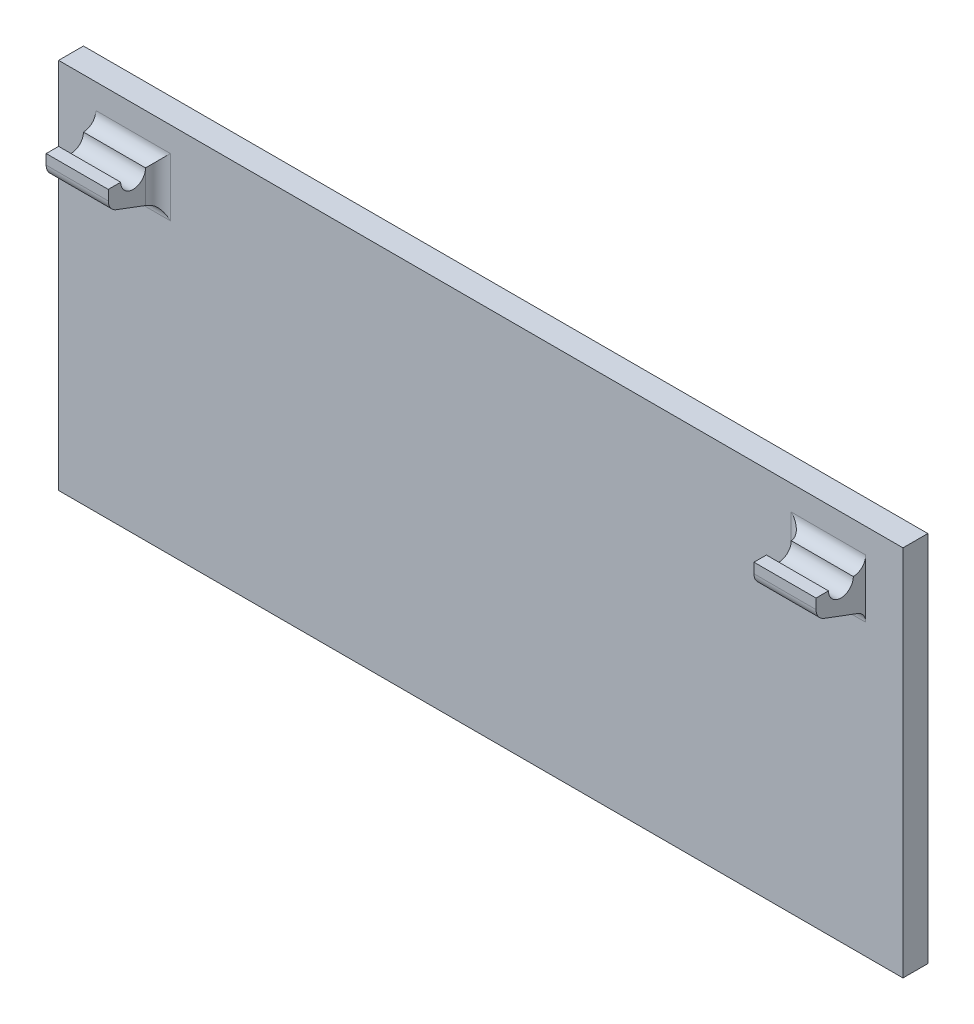
ISO-10303-21;
HEADER;
FILE_DESCRIPTION(('STEP AP214'),'2;1');
FILE_NAME('part.step','',(''),(''),'','','');
FILE_SCHEMA(('AUTOMOTIVE_DESIGN { 1 0 10303 214 1 1 1 1 }'));
ENDSEC;
DATA;
#1=APPLICATION_CONTEXT('core data for automotive mechanical design processes');
#2=APPLICATION_PROTOCOL_DEFINITION('international standard','automotive_design',2000,#1);
#3=PRODUCT_CONTEXT('',#1,'mechanical');
#4=PRODUCT('Part','Part','',(#3));
#5=PRODUCT_RELATED_PRODUCT_CATEGORY('part','',(#4));
#6=PRODUCT_DEFINITION_FORMATION('','',#4);
#7=PRODUCT_DEFINITION_CONTEXT('part definition',#1,'design');
#8=PRODUCT_DEFINITION('design','',#6,#7);
#9=PRODUCT_DEFINITION_SHAPE('','',#8);
#10=(LENGTH_UNIT() NAMED_UNIT(*) SI_UNIT(.MILLI.,.METRE.));
#11=(NAMED_UNIT(*) PLANE_ANGLE_UNIT() SI_UNIT($,.RADIAN.));
#12=(NAMED_UNIT(*) SI_UNIT($,.STERADIAN.) SOLID_ANGLE_UNIT());
#13=UNCERTAINTY_MEASURE_WITH_UNIT(LENGTH_MEASURE(1.E-05),#10,'distance_accuracy_value','');
#14=(GEOMETRIC_REPRESENTATION_CONTEXT(3) GLOBAL_UNCERTAINTY_ASSIGNED_CONTEXT((#13)) GLOBAL_UNIT_ASSIGNED_CONTEXT((#10,
#11,#12)) REPRESENTATION_CONTEXT('',''));
#15=CARTESIAN_POINT('',(0.,0.,0.));
#16=DIRECTION('',(0.,0.,1.));
#17=DIRECTION('',(1.,0.,0.));
#18=AXIS2_PLACEMENT_3D('',#15,#16,#17);
#19=CARTESIAN_POINT('',(0.,0.,10.));
#20=DIRECTION('',(0.,0.,1.));
#21=DIRECTION('',(1.,0.,0.));
#22=AXIS2_PLACEMENT_3D('',#19,#20,#21);
#23=PLANE('',#22);
#24=DIRECTION('',(0.,1.,0.));
#25=VECTOR('',#24,1.);
#26=CARTESIAN_POINT('',(169.999999999999,74.9999999999993,10.));
#27=LINE('',#26,#25);
#28=CARTESIAN_POINT('',(169.999999999999,-75.0000000000006,10.));
#29=VERTEX_POINT('',#28);
#30=CARTESIAN_POINT('',(169.999999999999,74.9999999999993,10.));
#31=VERTEX_POINT('',#30);
#32=EDGE_CURVE('E253',#29,#31,#27,.T.);
#33=ORIENTED_EDGE('',*,*,#32,.T.);
#34=DIRECTION('',(-1.,0.,0.));
#35=VECTOR('',#34,1.);
#36=CARTESIAN_POINT('',(-170.000000000001,74.9999999999993,10.));
#37=LINE('',#36,#35);
#38=CARTESIAN_POINT('',(-170.000000000001,74.9999999999993,10.));
#39=VERTEX_POINT('',#38);
#40=EDGE_CURVE('E256',#31,#39,#37,.T.);
#41=ORIENTED_EDGE('',*,*,#40,.T.);
#42=DIRECTION('',(0.,-1.,0.));
#43=VECTOR('',#42,1.);
#44=CARTESIAN_POINT('',(-170.000000000001,74.9999999999993,10.));
#45=LINE('',#44,#43);
#46=CARTESIAN_POINT('',(-170.000000000002,-75.0000000000006,10.));
#47=VERTEX_POINT('',#46);
#48=EDGE_CURVE('E259',#39,#47,#45,.T.);
#49=ORIENTED_EDGE('',*,*,#48,.T.);
#50=DIRECTION('',(1.,0.,0.));
#51=VECTOR('',#50,1.);
#52=CARTESIAN_POINT('',(-170.000000000002,-75.0000000000006,10.));
#53=LINE('',#52,#51);
#54=EDGE_CURVE('E261',#47,#29,#53,.T.);
#55=ORIENTED_EDGE('',*,*,#54,.T.);
#56=EDGE_LOOP('',(#33,#41,#49,#55));
#57=FACE_BOUND('',#56,.T.);
#58=DIRECTION('',(1.,0.,0.));
#59=VECTOR('',#58,1.);
#60=CARTESIAN_POINT('',(0.,64.9999999999993,10.));
#61=LINE('',#60,#59);
#62=CARTESIAN_POINT('',(124.999999999999,64.9999999999993,10.));
#63=VERTEX_POINT('',#62);
#64=CARTESIAN_POINT('',(154.999999999999,64.9999999999993,10.));
#65=VERTEX_POINT('',#64);
#66=EDGE_CURVE('E286',#63,#65,#61,.T.);
#67=ORIENTED_EDGE('',*,*,#66,.T.);
#68=DIRECTION('',(0.,-1.,0.));
#69=VECTOR('',#68,1.);
#70=CARTESIAN_POINT('',(154.999999999999,54.9999999999993,10.));
#71=LINE('',#70,#69);
#72=CARTESIAN_POINT('',(154.999999999999,41.5349976591758,10.));
#73=VERTEX_POINT('',#72);
#74=EDGE_CURVE('E230',#65,#73,#71,.T.);
#75=ORIENTED_EDGE('',*,*,#74,.T.);
#76=DIRECTION('',(1.,0.,0.));
#77=VECTOR('',#76,1.);
#78=CARTESIAN_POINT('',(0.,41.5349976591758,10.));
#79=LINE('',#78,#77);
#80=CARTESIAN_POINT('',(124.999999999999,41.5349976591758,10.));
#81=VERTEX_POINT('',#80);
#82=EDGE_CURVE('E282',#73,#81,#79,.F.);
#83=ORIENTED_EDGE('',*,*,#82,.T.);
#84=DIRECTION('',(0.,-1.,0.));
#85=VECTOR('',#84,1.);
#86=CARTESIAN_POINT('',(124.999999999999,0.,10.));
#87=LINE('',#86,#85);
#88=EDGE_CURVE('E284',#81,#63,#87,.F.);
#89=ORIENTED_EDGE('',*,*,#88,.T.);
#90=EDGE_LOOP('',(#67,#75,#83,#89));
#91=FACE_BOUND('',#90,.T.);
#92=DIRECTION('',(0.,-1.,0.));
#93=VECTOR('',#92,1.);
#94=CARTESIAN_POINT('',(-154.999999999999,59.9999999999993,10.));
#95=LINE('',#94,#93);
#96=CARTESIAN_POINT('',(-154.999999999999,64.9999999999993,10.));
#97=VERTEX_POINT('',#96);
#98=CARTESIAN_POINT('',(-154.999999999999,41.5349976591758,10.));
#99=VERTEX_POINT('',#98);
#100=EDGE_CURVE('E333',#97,#99,#95,.T.);
#101=ORIENTED_EDGE('',*,*,#100,.F.);
#102=DIRECTION('',(-1.,0.,0.));
#103=VECTOR('',#102,1.);
#104=CARTESIAN_POINT('',(-129.999999999999,64.9999999999993,10.));
#105=LINE('',#104,#103);
#106=CARTESIAN_POINT('',(-124.999999999999,64.9999999999993,10.));
#107=VERTEX_POINT('',#106);
#108=EDGE_CURVE('E293',#97,#107,#105,.F.);
#109=ORIENTED_EDGE('',*,*,#108,.T.);
#110=DIRECTION('',(0.,-1.,0.));
#111=VECTOR('',#110,1.);
#112=CARTESIAN_POINT('',(-124.999999999999,0.,10.));
#113=LINE('',#112,#111);
#114=CARTESIAN_POINT('',(-124.999999999999,41.5349976591758,10.));
#115=VERTEX_POINT('',#114);
#116=EDGE_CURVE('E211',#107,#115,#113,.T.);
#117=ORIENTED_EDGE('',*,*,#116,.T.);
#118=DIRECTION('',(-1.,0.,0.));
#119=VECTOR('',#118,1.);
#120=CARTESIAN_POINT('',(-154.999999999999,41.5349976591758,10.));
#121=LINE('',#120,#119);
#122=EDGE_CURVE('E289',#115,#99,#121,.T.);
#123=ORIENTED_EDGE('',*,*,#122,.T.);
#124=EDGE_LOOP('',(#101,#109,#117,#123));
#125=FACE_BOUND('',#124,.T.);
#126=ADVANCED_FACE('F33',(#57,#91,#125),#23,.T.);
#127=CARTESIAN_POINT('',(169.999999999999,74.9999999999993,10.));
#128=DIRECTION('',(-1.,0.,0.));
#129=DIRECTION('',(0.,0.,1.));
#130=AXIS2_PLACEMENT_3D('',#127,#128,#129);
#131=PLANE('',#130);
#132=DIRECTION('',(0.,1.,0.));
#133=VECTOR('',#132,1.);
#134=CARTESIAN_POINT('',(169.999999999999,74.9999999999993,0.));
#135=LINE('',#134,#133);
#136=CARTESIAN_POINT('',(169.999999999999,-75.0000000000006,0.));
#137=VERTEX_POINT('',#136);
#138=CARTESIAN_POINT('',(169.999999999999,74.9999999999993,0.));
#139=VERTEX_POINT('',#138);
#140=EDGE_CURVE('E252',#137,#139,#135,.T.);
#141=ORIENTED_EDGE('',*,*,#140,.T.);
#142=DIRECTION('',(0.,0.,-1.));
#143=VECTOR('',#142,1.);
#144=CARTESIAN_POINT('',(169.999999999999,74.9999999999993,10.));
#145=LINE('',#144,#143);
#146=EDGE_CURVE('E279',#31,#139,#145,.T.);
#147=ORIENTED_EDGE('',*,*,#146,.F.);
#148=ORIENTED_EDGE('',*,*,#32,.F.);
#149=DIRECTION('',(0.,0.,-1.));
#150=VECTOR('',#149,1.);
#151=CARTESIAN_POINT('',(169.999999999999,-75.0000000000006,10.));
#152=LINE('',#151,#150);
#153=EDGE_CURVE('E263',#29,#137,#152,.T.);
#154=ORIENTED_EDGE('',*,*,#153,.T.);
#155=EDGE_LOOP('',(#141,#147,#148,#154));
#156=FACE_BOUND('',#155,.T.);
#157=ADVANCED_FACE('F373',(#156),#131,.F.);
#158=CARTESIAN_POINT('',(-170.000000000001,74.9999999999993,10.));
#159=DIRECTION('',(0.,-1.,0.));
#160=DIRECTION('',(0.,0.,-1.));
#161=AXIS2_PLACEMENT_3D('',#158,#159,#160);
#162=PLANE('',#161);
#163=DIRECTION('',(-1.,0.,0.));
#164=VECTOR('',#163,1.);
#165=CARTESIAN_POINT('',(-170.000000000001,74.9999999999993,0.));
#166=LINE('',#165,#164);
#167=CARTESIAN_POINT('',(-170.000000000001,74.9999999999993,0.));
#168=VERTEX_POINT('',#167);
#169=EDGE_CURVE('E266',#139,#168,#166,.T.);
#170=ORIENTED_EDGE('',*,*,#169,.T.);
#171=DIRECTION('',(0.,0.,-1.));
#172=VECTOR('',#171,1.);
#173=CARTESIAN_POINT('',(-170.000000000001,74.9999999999993,10.));
#174=LINE('',#173,#172);
#175=EDGE_CURVE('E276',#39,#168,#174,.T.);
#176=ORIENTED_EDGE('',*,*,#175,.F.);
#177=ORIENTED_EDGE('',*,*,#40,.F.);
#178=ORIENTED_EDGE('',*,*,#146,.T.);
#179=EDGE_LOOP('',(#170,#176,#177,#178));
#180=FACE_BOUND('',#179,.T.);
#181=ADVANCED_FACE('F379',(#180),#162,.F.);
#182=CARTESIAN_POINT('',(-170.000000000001,74.9999999999993,10.));
#183=DIRECTION('',(1.,0.,0.));
#184=DIRECTION('',(0.,1.,0.));
#185=AXIS2_PLACEMENT_3D('',#182,#183,#184);
#186=PLANE('',#185);
#187=DIRECTION('',(0.,-1.,0.));
#188=VECTOR('',#187,1.);
#189=CARTESIAN_POINT('',(-170.000000000001,74.9999999999993,0.));
#190=LINE('',#189,#188);
#191=CARTESIAN_POINT('',(-170.000000000002,-75.0000000000006,0.));
#192=VERTEX_POINT('',#191);
#193=EDGE_CURVE('E268',#168,#192,#190,.T.);
#194=ORIENTED_EDGE('',*,*,#193,.T.);
#195=DIRECTION('',(0.,0.,-1.));
#196=VECTOR('',#195,1.);
#197=CARTESIAN_POINT('',(-170.000000000002,-75.0000000000006,10.));
#198=LINE('',#197,#196);
#199=EDGE_CURVE('E273',#47,#192,#198,.T.);
#200=ORIENTED_EDGE('',*,*,#199,.F.);
#201=ORIENTED_EDGE('',*,*,#48,.F.);
#202=ORIENTED_EDGE('',*,*,#175,.T.);
#203=EDGE_LOOP('',(#194,#200,#201,#202));
#204=FACE_BOUND('',#203,.T.);
#205=ADVANCED_FACE('F394',(#204),#186,.F.);
#206=CARTESIAN_POINT('',(-170.000000000002,-75.0000000000006,10.));
#207=DIRECTION('',(0.,1.,0.));
#208=DIRECTION('',(0.,0.,1.));
#209=AXIS2_PLACEMENT_3D('',#206,#207,#208);
#210=PLANE('',#209);
#211=DIRECTION('',(1.,0.,0.));
#212=VECTOR('',#211,1.);
#213=CARTESIAN_POINT('',(-170.000000000002,-75.0000000000006,0.));
#214=LINE('',#213,#212);
#215=EDGE_CURVE('E257',#192,#137,#214,.T.);
#216=ORIENTED_EDGE('',*,*,#215,.T.);
#217=ORIENTED_EDGE('',*,*,#153,.F.);
#218=ORIENTED_EDGE('',*,*,#54,.F.);
#219=ORIENTED_EDGE('',*,*,#199,.T.);
#220=EDGE_LOOP('',(#216,#217,#218,#219));
#221=FACE_BOUND('',#220,.T.);
#222=ADVANCED_FACE('F390',(#221),#210,.F.);
#223=CARTESIAN_POINT('',(0.,0.,0.));
#224=DIRECTION('',(0.,0.,1.));
#225=DIRECTION('',(1.,0.,0.));
#226=AXIS2_PLACEMENT_3D('',#223,#224,#225);
#227=PLANE('',#226);
#228=ORIENTED_EDGE('',*,*,#140,.F.);
#229=ORIENTED_EDGE('',*,*,#215,.F.);
#230=ORIENTED_EDGE('',*,*,#193,.F.);
#231=ORIENTED_EDGE('',*,*,#169,.F.);
#232=EDGE_LOOP('',(#228,#229,#230,#231));
#233=FACE_BOUND('',#232,.T.);
#234=ADVANCED_FACE('F387',(#233),#227,.F.);
#235=CARTESIAN_POINT('',(129.999999999999,44.9999999999993,10.));
#236=DIRECTION('',(0.,0.936329177569045,-0.351123441588391));
#237=DIRECTION('',(0.,0.351123441588391,0.936329177569045));
#238=AXIS2_PLACEMENT_3D('',#235,#236,#237);
#239=PLANE('',#238);
#240=DIRECTION('',(0.,0.351123441588391,0.936329177569045));
#241=VECTOR('',#240,1.);
#242=CARTESIAN_POINT('',(154.999999999999,44.9999999999993,10.));
#243=LINE('',#242,#241);
#244=CARTESIAN_POINT('',(154.999999999999,46.2166435470211,13.244382792058));
#245=VERTEX_POINT('',#244);
#246=CARTESIAN_POINT('',(154.999999999999,51.2833564529775,26.755617207942));
#247=VERTEX_POINT('',#246);
#248=EDGE_CURVE('E217',#245,#247,#243,.T.);
#249=ORIENTED_EDGE('',*,*,#248,.T.);
#250=DIRECTION('',(1.,0.,0.));
#251=VECTOR('',#250,1.);
#252=CARTESIAN_POINT('',(129.999999999999,51.2833564529775,26.755617207942));
#253=LINE('',#252,#251);
#254=CARTESIAN_POINT('',(129.999999999999,51.2833564529775,26.755617207942));
#255=VERTEX_POINT('',#254);
#256=EDGE_CURVE('E309',#247,#255,#253,.F.);
#257=ORIENTED_EDGE('',*,*,#256,.T.);
#258=DIRECTION('',(0.,0.351123441588391,0.936329177569045));
#259=VECTOR('',#258,1.);
#260=CARTESIAN_POINT('',(129.999999999999,44.9999999999993,10.));
#261=LINE('',#260,#259);
#262=CARTESIAN_POINT('',(129.999999999999,46.8749999999993,15.));
#263=VERTEX_POINT('',#262);
#264=EDGE_CURVE('E226',#263,#255,#261,.T.);
#265=ORIENTED_EDGE('',*,*,#264,.F.);
#266=CARTESIAN_POINT('',(124.999999999999,46.8749999999993,15.));
#267=DIRECTION('',(0.,0.936329177569045,-0.351123441588391));
#268=DIRECTION('',(0.,-0.351123441588391,-0.936329177569045));
#269=AXIS2_PLACEMENT_3D('',#266,#267,#268);
#270=ELLIPSE('',#269,5.34000234082346,5.);
#271=CARTESIAN_POINT('',(129.681645887844,46.2166435470211,13.244382792058));
#272=VERTEX_POINT('',#271);
#273=EDGE_CURVE('E318',#263,#272,#270,.T.);
#274=ORIENTED_EDGE('',*,*,#273,.T.);
#275=DIRECTION('',(1.,0.,0.));
#276=VECTOR('',#275,1.);
#277=CARTESIAN_POINT('',(129.999999999999,46.2166435470211,13.244382792058));
#278=LINE('',#277,#276);
#279=EDGE_CURVE('E58',#272,#245,#278,.T.);
#280=ORIENTED_EDGE('',*,*,#279,.T.);
#281=EDGE_LOOP('',(#249,#257,#265,#274,#280));
#282=FACE_BOUND('',#281,.T.);
#283=ADVANCED_FACE('F385',(#282),#239,.F.);
#284=CARTESIAN_POINT('',(129.999999999999,52.4999999999993,30.));
#285=DIRECTION('',(0.,0.,-1.));
#286=DIRECTION('',(-1.,0.,0.));
#287=AXIS2_PLACEMENT_3D('',#284,#285,#286);
#288=PLANE('',#287);
#289=DIRECTION('',(0.,1.,0.));
#290=VECTOR('',#289,1.);
#291=CARTESIAN_POINT('',(129.999999999999,52.4999999999993,30.));
#292=LINE('',#291,#290);
#293=CARTESIAN_POINT('',(129.999999999999,55.9650023408227,30.));
#294=VERTEX_POINT('',#293);
#295=CARTESIAN_POINT('',(129.999999999999,59.9999999999993,30.));
#296=VERTEX_POINT('',#295);
#297=EDGE_CURVE('E229',#294,#296,#292,.T.);
#298=ORIENTED_EDGE('',*,*,#297,.F.);
#299=DIRECTION('',(1.,0.,0.));
#300=VECTOR('',#299,1.);
#301=CARTESIAN_POINT('',(129.999999999999,55.9650023408227,30.));
#302=LINE('',#301,#300);
#303=CARTESIAN_POINT('',(154.999999999999,55.9650023408227,30.));
#304=VERTEX_POINT('',#303);
#305=EDGE_CURVE('E303',#294,#304,#302,.T.);
#306=ORIENTED_EDGE('',*,*,#305,.T.);
#307=DIRECTION('',(0.,1.,0.));
#308=VECTOR('',#307,1.);
#309=CARTESIAN_POINT('',(154.999999999999,52.4999999999993,30.));
#310=LINE('',#309,#308);
#311=CARTESIAN_POINT('',(154.999999999999,59.9999999999993,30.));
#312=VERTEX_POINT('',#311);
#313=EDGE_CURVE('E220',#304,#312,#310,.T.);
#314=ORIENTED_EDGE('',*,*,#313,.T.);
#315=DIRECTION('',(1.,0.,0.));
#316=VECTOR('',#315,1.);
#317=CARTESIAN_POINT('',(129.999999999999,59.9999999999993,30.));
#318=LINE('',#317,#316);
#319=EDGE_CURVE('E249',#296,#312,#318,.T.);
#320=ORIENTED_EDGE('',*,*,#319,.F.);
#321=EDGE_LOOP('',(#298,#306,#314,#320));
#322=FACE_BOUND('',#321,.T.);
#323=ADVANCED_FACE('F435',(#322),#288,.F.);
#324=CARTESIAN_POINT('',(129.999999999999,59.9999999999993,30.));
#325=DIRECTION('',(0.,-1.,0.));
#326=DIRECTION('',(0.,0.,-1.));
#327=AXIS2_PLACEMENT_3D('',#324,#325,#326);
#328=PLANE('',#327);
#329=DIRECTION('',(0.,0.,-1.));
#330=VECTOR('',#329,1.);
#331=CARTESIAN_POINT('',(154.999999999999,59.9999999999993,30.));
#332=LINE('',#331,#330);
#333=CARTESIAN_POINT('',(154.999999999999,59.9999999999993,25.));
#334=VERTEX_POINT('',#333);
#335=EDGE_CURVE('E238',#312,#334,#332,.T.);
#336=ORIENTED_EDGE('',*,*,#335,.T.);
#337=DIRECTION('',(1.,0.,0.));
#338=VECTOR('',#337,1.);
#339=CARTESIAN_POINT('',(129.999999999999,59.9999999999993,25.));
#340=LINE('',#339,#338);
#341=CARTESIAN_POINT('',(129.999999999999,59.9999999999993,25.));
#342=VERTEX_POINT('',#341);
#343=EDGE_CURVE('E246',#342,#334,#340,.T.);
#344=ORIENTED_EDGE('',*,*,#343,.F.);
#345=DIRECTION('',(0.,0.,-1.));
#346=VECTOR('',#345,1.);
#347=CARTESIAN_POINT('',(129.999999999999,59.9999999999993,30.));
#348=LINE('',#347,#346);
#349=EDGE_CURVE('E232',#296,#342,#348,.T.);
#350=ORIENTED_EDGE('',*,*,#349,.F.);
#351=ORIENTED_EDGE('',*,*,#319,.T.);
#352=EDGE_LOOP('',(#336,#344,#350,#351));
#353=FACE_BOUND('',#352,.T.);
#354=ADVANCED_FACE('F441',(#353),#328,.F.);
#355=CARTESIAN_POINT('',(129.999999999999,59.9999999999993,20.));
#356=DIRECTION('',(1.,0.,0.));
#357=DIRECTION('',(0.,0.,-1.));
#358=AXIS2_PLACEMENT_3D('',#355,#356,#357);
#359=CYLINDRICAL_SURFACE('',#358,5.);
#360=CARTESIAN_POINT('',(154.999999999999,59.9999999999993,20.));
#361=DIRECTION('',(1.,0.,0.));
#362=DIRECTION('',(0.,0.,-1.));
#363=AXIS2_PLACEMENT_3D('',#360,#361,#362);
#364=CIRCLE('',#363,5.);
#365=CARTESIAN_POINT('',(154.999999999999,59.9999999999993,15.));
#366=VERTEX_POINT('',#365);
#367=EDGE_CURVE('E240',#334,#366,#364,.T.);
#368=ORIENTED_EDGE('',*,*,#367,.T.);
#369=DIRECTION('',(1.,0.,0.));
#370=VECTOR('',#369,1.);
#371=CARTESIAN_POINT('',(129.999999999999,59.9999999999993,15.));
#372=LINE('',#371,#370);
#373=CARTESIAN_POINT('',(129.999999999999,59.9999999999993,15.));
#374=VERTEX_POINT('',#373);
#375=EDGE_CURVE('E235',#374,#366,#372,.T.);
#376=ORIENTED_EDGE('',*,*,#375,.F.);
#377=CARTESIAN_POINT('',(129.999999999999,59.9999999999993,20.));
#378=DIRECTION('',(1.,0.,0.));
#379=DIRECTION('',(0.,0.,-1.));
#380=AXIS2_PLACEMENT_3D('',#377,#378,#379);
#381=CIRCLE('',#380,5.);
#382=EDGE_CURVE('E234',#342,#374,#381,.T.);
#383=ORIENTED_EDGE('',*,*,#382,.F.);
#384=ORIENTED_EDGE('',*,*,#343,.T.);
#385=EDGE_LOOP('',(#368,#376,#383,#384));
#386=FACE_BOUND('',#385,.T.);
#387=ADVANCED_FACE('F446',(#386),#359,.F.);
#388=CARTESIAN_POINT('',(129.999999999999,59.9999999999993,20.));
#389=DIRECTION('',(1.,0.,0.));
#390=DIRECTION('',(0.,0.,-1.));
#391=AXIS2_PLACEMENT_3D('',#388,#389,#390);
#392=PLANE('',#391);
#393=ORIENTED_EDGE('',*,*,#264,.T.);
#394=CARTESIAN_POINT('',(129.999999999999,55.9650023408227,25.));
#395=DIRECTION('',(1.,0.,0.));
#396=DIRECTION('',(0.,0.,-1.));
#397=AXIS2_PLACEMENT_3D('',#394,#395,#396);
#398=CIRCLE('',#397,5.);
#399=EDGE_CURVE('E313',#255,#294,#398,.F.);
#400=ORIENTED_EDGE('',*,*,#399,.T.);
#401=ORIENTED_EDGE('',*,*,#297,.T.);
#402=ORIENTED_EDGE('',*,*,#349,.T.);
#403=ORIENTED_EDGE('',*,*,#382,.T.);
#404=DIRECTION('',(0.,-1.,0.));
#405=VECTOR('',#404,1.);
#406=CARTESIAN_POINT('',(129.999999999999,59.9999999999993,15.));
#407=LINE('',#406,#405);
#408=EDGE_CURVE('E311',#374,#263,#407,.T.);
#409=ORIENTED_EDGE('',*,*,#408,.T.);
#410=EDGE_LOOP('',(#393,#400,#401,#402,#403,#409));
#411=FACE_BOUND('',#410,.T.);
#412=ADVANCED_FACE('F431',(#411),#392,.F.);
#413=CARTESIAN_POINT('',(154.999999999999,59.9999999999993,20.));
#414=DIRECTION('',(1.,0.,0.));
#415=DIRECTION('',(0.,0.,-1.));
#416=AXIS2_PLACEMENT_3D('',#413,#414,#415);
#417=PLANE('',#416);
#418=ORIENTED_EDGE('',*,*,#313,.F.);
#419=CARTESIAN_POINT('',(154.999999999999,55.9650023408227,25.));
#420=DIRECTION('',(1.,0.,0.));
#421=DIRECTION('',(0.,0.,-1.));
#422=AXIS2_PLACEMENT_3D('',#419,#420,#421);
#423=CIRCLE('',#422,5.);
#424=EDGE_CURVE('E306',#304,#247,#423,.T.);
#425=ORIENTED_EDGE('',*,*,#424,.T.);
#426=ORIENTED_EDGE('',*,*,#248,.F.);
#427=CARTESIAN_POINT('',(154.999999999999,41.5349976591758,15.));
#428=DIRECTION('',(1.,0.,0.));
#429=DIRECTION('',(0.,0.,-1.));
#430=AXIS2_PLACEMENT_3D('',#427,#428,#429);
#431=CIRCLE('',#430,5.);
#432=EDGE_CURVE('E11',#245,#73,#431,.F.);
#433=ORIENTED_EDGE('',*,*,#432,.T.);
#434=ORIENTED_EDGE('',*,*,#74,.F.);
#435=CARTESIAN_POINT('',(154.999999999999,64.9999999999993,15.));
#436=DIRECTION('',(1.,0.,0.));
#437=DIRECTION('',(0.,0.,-1.));
#438=AXIS2_PLACEMENT_3D('',#435,#436,#437);
#439=CIRCLE('',#438,5.);
#440=EDGE_CURVE('E315',#65,#366,#439,.F.);
#441=ORIENTED_EDGE('',*,*,#440,.T.);
#442=ORIENTED_EDGE('',*,*,#367,.F.);
#443=ORIENTED_EDGE('',*,*,#335,.F.);
#444=EDGE_LOOP('',(#418,#425,#426,#433,#434,#441,#442,#443));
#445=FACE_BOUND('',#444,.T.);
#446=ADVANCED_FACE('F455',(#445),#417,.T.);
#447=CARTESIAN_POINT('',(-129.999999999999,44.9999999999993,10.));
#448=DIRECTION('',(0.,-0.936329177569045,0.351123441588391));
#449=DIRECTION('',(0.,-0.351123441588391,-0.936329177569045));
#450=AXIS2_PLACEMENT_3D('',#447,#448,#449);
#451=PLANE('',#450);
#452=DIRECTION('',(0.,0.351123441588391,0.936329177569045));
#453=VECTOR('',#452,1.);
#454=CARTESIAN_POINT('',(-129.999999999999,44.9999999999993,10.));
#455=LINE('',#454,#453);
#456=CARTESIAN_POINT('',(-129.999999999999,46.8749999999993,15.));
#457=VERTEX_POINT('',#456);
#458=CARTESIAN_POINT('',(-129.999999999999,51.2833564529775,26.755617207942));
#459=VERTEX_POINT('',#458);
#460=EDGE_CURVE('E189',#457,#459,#455,.T.);
#461=ORIENTED_EDGE('',*,*,#460,.T.);
#462=DIRECTION('',(-1.,0.,0.));
#463=VECTOR('',#462,1.);
#464=CARTESIAN_POINT('',(-129.999999999999,51.2833564529775,26.755617207942));
#465=LINE('',#464,#463);
#466=CARTESIAN_POINT('',(-154.999999999999,51.2833564529775,26.755617207942));
#467=VERTEX_POINT('',#466);
#468=EDGE_CURVE('E296',#459,#467,#465,.T.);
#469=ORIENTED_EDGE('',*,*,#468,.T.);
#470=DIRECTION('',(0.,0.351123441588391,0.936329177569045));
#471=VECTOR('',#470,1.);
#472=CARTESIAN_POINT('',(-154.999999999999,44.9999999999993,10.));
#473=LINE('',#472,#471);
#474=CARTESIAN_POINT('',(-154.999999999999,46.2166435470211,13.244382792058));
#475=VERTEX_POINT('',#474);
#476=EDGE_CURVE('E328',#475,#467,#473,.T.);
#477=ORIENTED_EDGE('',*,*,#476,.F.);
#478=DIRECTION('',(-1.,0.,0.));
#479=VECTOR('',#478,1.);
#480=CARTESIAN_POINT('',(-129.999999999999,46.2166435470211,13.244382792058));
#481=LINE('',#480,#479);
#482=CARTESIAN_POINT('',(-129.681645887844,46.2166435470211,13.244382792058));
#483=VERTEX_POINT('',#482);
#484=EDGE_CURVE('E50',#475,#483,#481,.F.);
#485=ORIENTED_EDGE('',*,*,#484,.T.);
#486=CARTESIAN_POINT('',(-124.999999999999,46.8749999999993,15.));
#487=DIRECTION('',(0.,-0.936329177569045,0.351123441588391));
#488=DIRECTION('',(0.,-0.351123441588391,-0.936329177569045));
#489=AXIS2_PLACEMENT_3D('',#486,#487,#488);
#490=ELLIPSE('',#489,5.34000234082346,5.);
#491=EDGE_CURVE('E320',#483,#457,#490,.F.);
#492=ORIENTED_EDGE('',*,*,#491,.T.);
#493=EDGE_LOOP('',(#461,#469,#477,#485,#492));
#494=FACE_BOUND('',#493,.T.);
#495=ADVANCED_FACE('F355',(#494),#451,.T.);
#496=CARTESIAN_POINT('',(-129.999999999999,59.9999999999993,20.));
#497=DIRECTION('',(-1.,0.,0.));
#498=DIRECTION('',(0.,0.,1.));
#499=AXIS2_PLACEMENT_3D('',#496,#497,#498);
#500=CYLINDRICAL_SURFACE('',#499,5.);
#501=CARTESIAN_POINT('',(-154.999999999999,59.9999999999993,20.));
#502=DIRECTION('',(1.,0.,0.));
#503=DIRECTION('',(0.,0.,-1.));
#504=AXIS2_PLACEMENT_3D('',#501,#502,#503);
#505=CIRCLE('',#504,5.);
#506=CARTESIAN_POINT('',(-154.999999999999,59.9999999999993,25.));
#507=VERTEX_POINT('',#506);
#508=CARTESIAN_POINT('',(-154.999999999999,59.9999999999993,15.));
#509=VERTEX_POINT('',#508);
#510=EDGE_CURVE('E336',#507,#509,#505,.T.);
#511=ORIENTED_EDGE('',*,*,#510,.F.);
#512=DIRECTION('',(-1.,0.,0.));
#513=VECTOR('',#512,1.);
#514=CARTESIAN_POINT('',(-129.999999999999,59.9999999999993,25.));
#515=LINE('',#514,#513);
#516=CARTESIAN_POINT('',(-129.999999999999,59.9999999999993,25.));
#517=VERTEX_POINT('',#516);
#518=EDGE_CURVE('E203',#517,#507,#515,.T.);
#519=ORIENTED_EDGE('',*,*,#518,.F.);
#520=CARTESIAN_POINT('',(-129.999999999999,59.9999999999993,20.));
#521=DIRECTION('',(1.,0.,0.));
#522=DIRECTION('',(0.,0.,-1.));
#523=AXIS2_PLACEMENT_3D('',#520,#521,#522);
#524=CIRCLE('',#523,5.);
#525=CARTESIAN_POINT('',(-129.999999999999,59.9999999999993,15.));
#526=VERTEX_POINT('',#525);
#527=EDGE_CURVE('E186',#517,#526,#524,.T.);
#528=ORIENTED_EDGE('',*,*,#527,.T.);
#529=DIRECTION('',(-1.,0.,0.));
#530=VECTOR('',#529,1.);
#531=CARTESIAN_POINT('',(-129.999999999999,59.9999999999993,15.));
#532=LINE('',#531,#530);
#533=EDGE_CURVE('E201',#526,#509,#532,.T.);
#534=ORIENTED_EDGE('',*,*,#533,.T.);
#535=EDGE_LOOP('',(#511,#519,#528,#534));
#536=FACE_BOUND('',#535,.T.);
#537=ADVANCED_FACE('F199',(#536),#500,.F.);
#538=CARTESIAN_POINT('',(-129.999999999999,59.9999999999993,30.));
#539=DIRECTION('',(0.,1.,0.));
#540=DIRECTION('',(0.,0.,1.));
#541=AXIS2_PLACEMENT_3D('',#538,#539,#540);
#542=PLANE('',#541);
#543=DIRECTION('',(0.,0.,-1.));
#544=VECTOR('',#543,1.);
#545=CARTESIAN_POINT('',(-154.999999999999,59.9999999999993,30.));
#546=LINE('',#545,#544);
#547=CARTESIAN_POINT('',(-154.999999999999,59.9999999999993,30.));
#548=VERTEX_POINT('',#547);
#549=EDGE_CURVE('E343',#548,#507,#546,.T.);
#550=ORIENTED_EDGE('',*,*,#549,.F.);
#551=DIRECTION('',(-1.,0.,0.));
#552=VECTOR('',#551,1.);
#553=CARTESIAN_POINT('',(-129.999999999999,59.9999999999993,30.));
#554=LINE('',#553,#552);
#555=CARTESIAN_POINT('',(-129.999999999999,59.9999999999993,30.));
#556=VERTEX_POINT('',#555);
#557=EDGE_CURVE('E222',#556,#548,#554,.T.);
#558=ORIENTED_EDGE('',*,*,#557,.F.);
#559=DIRECTION('',(0.,0.,-1.));
#560=VECTOR('',#559,1.);
#561=CARTESIAN_POINT('',(-129.999999999999,59.9999999999993,30.));
#562=LINE('',#561,#560);
#563=EDGE_CURVE('E204',#556,#517,#562,.T.);
#564=ORIENTED_EDGE('',*,*,#563,.T.);
#565=ORIENTED_EDGE('',*,*,#518,.T.);
#566=EDGE_LOOP('',(#550,#558,#564,#565));
#567=FACE_BOUND('',#566,.T.);
#568=ADVANCED_FACE('F363',(#567),#542,.T.);
#569=CARTESIAN_POINT('',(-129.999999999999,52.4999999999993,30.));
#570=DIRECTION('',(0.,0.,1.));
#571=DIRECTION('',(1.,0.,0.));
#572=AXIS2_PLACEMENT_3D('',#569,#570,#571);
#573=PLANE('',#572);
#574=DIRECTION('',(0.,1.,0.));
#575=VECTOR('',#574,1.);
#576=CARTESIAN_POINT('',(-154.999999999999,52.4999999999993,30.));
#577=LINE('',#576,#575);
#578=CARTESIAN_POINT('',(-154.999999999999,55.9650023408227,30.));
#579=VERTEX_POINT('',#578);
#580=EDGE_CURVE('E346',#579,#548,#577,.T.);
#581=ORIENTED_EDGE('',*,*,#580,.F.);
#582=DIRECTION('',(-1.,0.,0.));
#583=VECTOR('',#582,1.);
#584=CARTESIAN_POINT('',(-129.999999999999,55.9650023408227,30.));
#585=LINE('',#584,#583);
#586=CARTESIAN_POINT('',(-129.999999999999,55.9650023408227,30.));
#587=VERTEX_POINT('',#586);
#588=EDGE_CURVE('E194',#579,#587,#585,.F.);
#589=ORIENTED_EDGE('',*,*,#588,.T.);
#590=DIRECTION('',(0.,1.,0.));
#591=VECTOR('',#590,1.);
#592=CARTESIAN_POINT('',(-129.999999999999,52.4999999999993,30.));
#593=LINE('',#592,#591);
#594=EDGE_CURVE('E339',#587,#556,#593,.T.);
#595=ORIENTED_EDGE('',*,*,#594,.T.);
#596=ORIENTED_EDGE('',*,*,#557,.T.);
#597=EDGE_LOOP('',(#581,#589,#595,#596));
#598=FACE_BOUND('',#597,.T.);
#599=ADVANCED_FACE('F361',(#598),#573,.T.);
#600=CARTESIAN_POINT('',(-129.999999999999,59.9999999999993,20.));
#601=DIRECTION('',(-1.,0.,0.));
#602=DIRECTION('',(0.,0.,-1.));
#603=AXIS2_PLACEMENT_3D('',#600,#601,#602);
#604=PLANE('',#603);
#605=ORIENTED_EDGE('',*,*,#594,.F.);
#606=CARTESIAN_POINT('',(-129.999999999999,55.9650023408227,25.));
#607=DIRECTION('',(-1.,0.,0.));
#608=DIRECTION('',(0.,0.,1.));
#609=AXIS2_PLACEMENT_3D('',#606,#607,#608);
#610=CIRCLE('',#609,5.);
#611=EDGE_CURVE('E193',#587,#459,#610,.F.);
#612=ORIENTED_EDGE('',*,*,#611,.T.);
#613=ORIENTED_EDGE('',*,*,#460,.F.);
#614=DIRECTION('',(0.,-1.,0.));
#615=VECTOR('',#614,1.);
#616=CARTESIAN_POINT('',(-129.999999999999,59.9999999999993,15.));
#617=LINE('',#616,#615);
#618=EDGE_CURVE('E181',#457,#526,#617,.F.);
#619=ORIENTED_EDGE('',*,*,#618,.T.);
#620=ORIENTED_EDGE('',*,*,#527,.F.);
#621=ORIENTED_EDGE('',*,*,#563,.F.);
#622=EDGE_LOOP('',(#605,#612,#613,#619,#620,#621));
#623=FACE_BOUND('',#622,.T.);
#624=ADVANCED_FACE('F184',(#623),#604,.F.);
#625=CARTESIAN_POINT('',(-154.999999999999,59.9999999999993,20.));
#626=DIRECTION('',(-1.,0.,0.));
#627=DIRECTION('',(0.,0.,-1.));
#628=AXIS2_PLACEMENT_3D('',#625,#626,#627);
#629=PLANE('',#628);
#630=ORIENTED_EDGE('',*,*,#476,.T.);
#631=CARTESIAN_POINT('',(-154.999999999999,55.9650023408227,25.));
#632=DIRECTION('',(-1.,0.,0.));
#633=DIRECTION('',(0.,0.,1.));
#634=AXIS2_PLACEMENT_3D('',#631,#632,#633);
#635=CIRCLE('',#634,5.);
#636=EDGE_CURVE('E299',#467,#579,#635,.T.);
#637=ORIENTED_EDGE('',*,*,#636,.T.);
#638=ORIENTED_EDGE('',*,*,#580,.T.);
#639=ORIENTED_EDGE('',*,*,#549,.T.);
#640=ORIENTED_EDGE('',*,*,#510,.T.);
#641=CARTESIAN_POINT('',(-154.999999999999,64.9999999999993,15.));
#642=DIRECTION('',(-1.,0.,0.));
#643=DIRECTION('',(0.,0.,1.));
#644=AXIS2_PLACEMENT_3D('',#641,#642,#643);
#645=CIRCLE('',#644,5.);
#646=EDGE_CURVE('E216',#509,#97,#645,.F.);
#647=ORIENTED_EDGE('',*,*,#646,.T.);
#648=ORIENTED_EDGE('',*,*,#100,.T.);
#649=CARTESIAN_POINT('',(-154.999999999999,41.5349976591758,15.));
#650=DIRECTION('',(-1.,0.,0.));
#651=DIRECTION('',(0.,0.,1.));
#652=AXIS2_PLACEMENT_3D('',#649,#650,#651);
#653=CIRCLE('',#652,5.);
#654=EDGE_CURVE('E42',#99,#475,#653,.F.);
#655=ORIENTED_EDGE('',*,*,#654,.T.);
#656=EDGE_LOOP('',(#630,#637,#638,#639,#640,#647,#648,#655));
#657=FACE_BOUND('',#656,.T.);
#658=ADVANCED_FACE('F360',(#657),#629,.T.);
#659=CARTESIAN_POINT('',(129.999999999999,41.5349976591758,15.));
#660=DIRECTION('',(1.,0.,0.));
#661=DIRECTION('',(0.,0.,-1.));
#662=AXIS2_PLACEMENT_3D('',#659,#660,#661);
#663=CYLINDRICAL_SURFACE('',#662,5.);
#664=ORIENTED_EDGE('',*,*,#279,.F.);
#665=CARTESIAN_POINT('',(124.999999999999,41.5349976591758,15.));
#666=DIRECTION('',(0.707106781186547,-0.707106781186547,0.));
#667=DIRECTION('',(0.707106781186547,0.707106781186547,0.));
#668=AXIS2_PLACEMENT_3D('',#665,#666,#667);
#669=ELLIPSE('',#668,7.07106781186547,5.);
#670=EDGE_CURVE('E326',#81,#272,#669,.T.);
#671=ORIENTED_EDGE('',*,*,#670,.F.);
#672=ORIENTED_EDGE('',*,*,#82,.F.);
#673=ORIENTED_EDGE('',*,*,#432,.F.);
#674=EDGE_LOOP('',(#664,#671,#672,#673));
#675=FACE_BOUND('',#674,.T.);
#676=ADVANCED_FACE('F410',(#675),#663,.F.);
#677=CARTESIAN_POINT('',(124.999999999999,59.9999999999993,15.));
#678=DIRECTION('',(0.,-1.,0.));
#679=DIRECTION('',(0.,0.,-1.));
#680=AXIS2_PLACEMENT_3D('',#677,#678,#679);
#681=CYLINDRICAL_SURFACE('',#680,5.);
#682=ORIENTED_EDGE('',*,*,#273,.F.);
#683=ORIENTED_EDGE('',*,*,#408,.F.);
#684=CARTESIAN_POINT('',(124.999999999999,64.9999999999993,15.));
#685=DIRECTION('',(-0.707106781186547,-0.707106781186547,0.));
#686=DIRECTION('',(0.707106781186547,-0.707106781186547,0.));
#687=AXIS2_PLACEMENT_3D('',#684,#685,#686);
#688=ELLIPSE('',#687,7.07106781186547,5.);
#689=EDGE_CURVE('E323',#63,#374,#688,.T.);
#690=ORIENTED_EDGE('',*,*,#689,.F.);
#691=ORIENTED_EDGE('',*,*,#88,.F.);
#692=ORIENTED_EDGE('',*,*,#670,.T.);
#693=EDGE_LOOP('',(#682,#683,#690,#691,#692));
#694=FACE_BOUND('',#693,.T.);
#695=ADVANCED_FACE('F406',(#694),#681,.F.);
#696=CARTESIAN_POINT('',(0.,64.9999999999993,15.));
#697=DIRECTION('',(1.,0.,0.));
#698=DIRECTION('',(0.,0.,-1.));
#699=AXIS2_PLACEMENT_3D('',#696,#697,#698);
#700=CYLINDRICAL_SURFACE('',#699,5.);
#701=ORIENTED_EDGE('',*,*,#689,.T.);
#702=ORIENTED_EDGE('',*,*,#375,.T.);
#703=ORIENTED_EDGE('',*,*,#440,.F.);
#704=ORIENTED_EDGE('',*,*,#66,.F.);
#705=EDGE_LOOP('',(#701,#702,#703,#704));
#706=FACE_BOUND('',#705,.T.);
#707=ADVANCED_FACE('F402',(#706),#700,.F.);
#708=CARTESIAN_POINT('',(0.,41.5349976591758,15.));
#709=DIRECTION('',(1.,0.,0.));
#710=DIRECTION('',(0.,0.,-1.));
#711=AXIS2_PLACEMENT_3D('',#708,#709,#710);
#712=CYLINDRICAL_SURFACE('',#711,5.);
#713=ORIENTED_EDGE('',*,*,#654,.F.);
#714=ORIENTED_EDGE('',*,*,#122,.F.);
#715=CARTESIAN_POINT('',(-124.999999999999,41.5349976591758,15.));
#716=DIRECTION('',(0.707106781186547,0.707106781186547,0.));
#717=DIRECTION('',(0.707106781186547,-0.707106781186547,0.));
#718=AXIS2_PLACEMENT_3D('',#715,#716,#717);
#719=ELLIPSE('',#718,7.07106781186547,5.);
#720=EDGE_CURVE('E37',#483,#115,#719,.F.);
#721=ORIENTED_EDGE('',*,*,#720,.F.);
#722=ORIENTED_EDGE('',*,*,#484,.F.);
#723=EDGE_LOOP('',(#713,#714,#721,#722));
#724=FACE_BOUND('',#723,.T.);
#725=ADVANCED_FACE('F405',(#724),#712,.F.);
#726=CARTESIAN_POINT('',(-124.999999999999,0.,15.));
#727=DIRECTION('',(0.,-1.,0.));
#728=DIRECTION('',(0.,0.,-1.));
#729=AXIS2_PLACEMENT_3D('',#726,#727,#728);
#730=CYLINDRICAL_SURFACE('',#729,5.);
#731=ORIENTED_EDGE('',*,*,#720,.T.);
#732=ORIENTED_EDGE('',*,*,#116,.F.);
#733=CARTESIAN_POINT('',(-124.999999999999,64.9999999999993,15.));
#734=DIRECTION('',(0.707106781186547,-0.707106781186547,0.));
#735=DIRECTION('',(-0.707106781186547,-0.707106781186547,0.));
#736=AXIS2_PLACEMENT_3D('',#733,#734,#735);
#737=ELLIPSE('',#736,7.07106781186547,5.);
#738=EDGE_CURVE('E208',#526,#107,#737,.T.);
#739=ORIENTED_EDGE('',*,*,#738,.F.);
#740=ORIENTED_EDGE('',*,*,#618,.F.);
#741=ORIENTED_EDGE('',*,*,#491,.F.);
#742=EDGE_LOOP('',(#731,#732,#739,#740,#741));
#743=FACE_BOUND('',#742,.T.);
#744=ADVANCED_FACE('F210',(#743),#730,.F.);
#745=CARTESIAN_POINT('',(-129.999999999999,64.9999999999993,15.));
#746=DIRECTION('',(1.,0.,0.));
#747=DIRECTION('',(0.,0.,-1.));
#748=AXIS2_PLACEMENT_3D('',#745,#746,#747);
#749=CYLINDRICAL_SURFACE('',#748,5.);
#750=ORIENTED_EDGE('',*,*,#738,.T.);
#751=ORIENTED_EDGE('',*,*,#108,.F.);
#752=ORIENTED_EDGE('',*,*,#646,.F.);
#753=ORIENTED_EDGE('',*,*,#533,.F.);
#754=EDGE_LOOP('',(#750,#751,#752,#753));
#755=FACE_BOUND('',#754,.T.);
#756=ADVANCED_FACE('F214',(#755),#749,.F.);
#757=CARTESIAN_POINT('',(-129.999999999999,55.9650023408227,25.));
#758=DIRECTION('',(-1.,0.,0.));
#759=DIRECTION('',(0.,0.,1.));
#760=AXIS2_PLACEMENT_3D('',#757,#758,#759);
#761=CYLINDRICAL_SURFACE('',#760,5.);
#762=ORIENTED_EDGE('',*,*,#611,.F.);
#763=ORIENTED_EDGE('',*,*,#588,.F.);
#764=ORIENTED_EDGE('',*,*,#636,.F.);
#765=ORIENTED_EDGE('',*,*,#468,.F.);
#766=EDGE_LOOP('',(#762,#763,#764,#765));
#767=FACE_BOUND('',#766,.T.);
#768=ADVANCED_FACE('F358',(#767),#761,.T.);
#769=CARTESIAN_POINT('',(129.999999999999,55.9650023408227,25.));
#770=DIRECTION('',(1.,0.,0.));
#771=DIRECTION('',(0.,0.,-1.));
#772=AXIS2_PLACEMENT_3D('',#769,#770,#771);
#773=CYLINDRICAL_SURFACE('',#772,5.);
#774=ORIENTED_EDGE('',*,*,#399,.F.);
#775=ORIENTED_EDGE('',*,*,#256,.F.);
#776=ORIENTED_EDGE('',*,*,#424,.F.);
#777=ORIENTED_EDGE('',*,*,#305,.F.);
#778=EDGE_LOOP('',(#774,#775,#776,#777));
#779=FACE_BOUND('',#778,.T.);
#780=ADVANCED_FACE('F35',(#779),#773,.T.);
#781=CLOSED_SHELL('',(#126,#157,#181,#205,#222,#234,#283,#323,#354,#387,#412,#446,#495,#537,
#568,#599,#624,#658,#676,#695,#707,#725,#744,#756,#768,#780));
#782=MANIFOLD_SOLID_BREP('B2',#781);
#783=ADVANCED_BREP_SHAPE_REPRESENTATION('',(#18,#782),#14);
#784=SHAPE_DEFINITION_REPRESENTATION(#9,#783);
ENDSEC;
END-ISO-10303-21;
